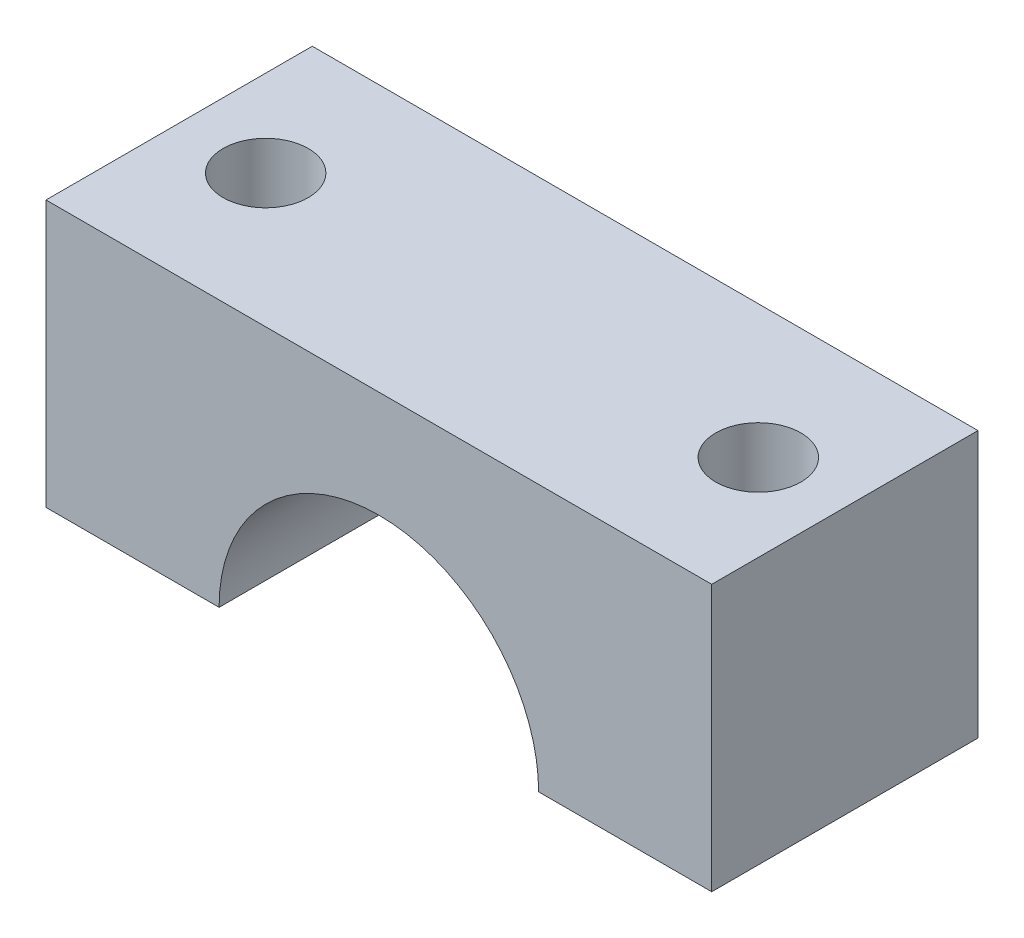
ISO-10303-21;
HEADER;
FILE_DESCRIPTION(('STEP AP214'),'2;1');
FILE_NAME('part.step','',(''),(''),'','','');
FILE_SCHEMA(('AUTOMOTIVE_DESIGN { 1 0 10303 214 1 1 1 1 }'));
ENDSEC;
DATA;
#1=APPLICATION_CONTEXT('core data for automotive mechanical design processes');
#2=APPLICATION_PROTOCOL_DEFINITION('international standard','automotive_design',2000,#1);
#3=PRODUCT_CONTEXT('',#1,'mechanical');
#4=PRODUCT('Part','Part','',(#3));
#5=PRODUCT_RELATED_PRODUCT_CATEGORY('part','',(#4));
#6=PRODUCT_DEFINITION_FORMATION('','',#4);
#7=PRODUCT_DEFINITION_CONTEXT('part definition',#1,'design');
#8=PRODUCT_DEFINITION('design','',#6,#7);
#9=PRODUCT_DEFINITION_SHAPE('','',#8);
#10=(LENGTH_UNIT() NAMED_UNIT(*) SI_UNIT(.MILLI.,.METRE.));
#11=(NAMED_UNIT(*) PLANE_ANGLE_UNIT() SI_UNIT($,.RADIAN.));
#12=(NAMED_UNIT(*) SI_UNIT($,.STERADIAN.) SOLID_ANGLE_UNIT());
#13=UNCERTAINTY_MEASURE_WITH_UNIT(LENGTH_MEASURE(1.E-05),#10,'distance_accuracy_value','');
#14=(GEOMETRIC_REPRESENTATION_CONTEXT(3) GLOBAL_UNCERTAINTY_ASSIGNED_CONTEXT((#13)) GLOBAL_UNIT_ASSIGNED_CONTEXT((#10,
#11,#12)) REPRESENTATION_CONTEXT('',''));
#15=CARTESIAN_POINT('',(0.,0.,0.));
#16=DIRECTION('',(0.,0.,1.));
#17=DIRECTION('',(1.,0.,0.));
#18=AXIS2_PLACEMENT_3D('',#15,#16,#17);
#19=CARTESIAN_POINT('',(0.,0.,0.));
#20=DIRECTION('',(0.,-1.,0.));
#21=DIRECTION('',(0.,0.,-1.));
#22=AXIS2_PLACEMENT_3D('',#19,#20,#21);
#23=PLANE('',#22);
#24=DIRECTION('',(0.,0.,1.));
#25=VECTOR('',#24,1.);
#26=CARTESIAN_POINT('',(5.99999999999999,0.,-20.));
#27=LINE('',#26,#25);
#28=CARTESIAN_POINT('',(5.99999999999999,0.,-5.));
#29=VERTEX_POINT('',#28);
#30=CARTESIAN_POINT('',(5.99999999999999,0.,5.));
#31=VERTEX_POINT('',#30);
#32=EDGE_CURVE('E11',#29,#31,#27,.T.);
#33=ORIENTED_EDGE('',*,*,#32,.F.);
#34=DIRECTION('',(-1.,0.,0.));
#35=VECTOR('',#34,1.);
#36=CARTESIAN_POINT('',(-12.5,0.,-5.));
#37=LINE('',#36,#35);
#38=CARTESIAN_POINT('',(12.5,0.,-5.));
#39=VERTEX_POINT('',#38);
#40=EDGE_CURVE('E127',#39,#29,#37,.T.);
#41=ORIENTED_EDGE('',*,*,#40,.F.);
#42=DIRECTION('',(0.,0.,-1.));
#43=VECTOR('',#42,1.);
#44=CARTESIAN_POINT('',(12.5,0.,5.));
#45=LINE('',#44,#43);
#46=CARTESIAN_POINT('',(12.5,0.,5.));
#47=VERTEX_POINT('',#46);
#48=EDGE_CURVE('E120',#47,#39,#45,.T.);
#49=ORIENTED_EDGE('',*,*,#48,.F.);
#50=DIRECTION('',(1.,0.,0.));
#51=VECTOR('',#50,1.);
#52=CARTESIAN_POINT('',(-12.5,0.,5.));
#53=LINE('',#52,#51);
#54=EDGE_CURVE('E89',#31,#47,#53,.T.);
#55=ORIENTED_EDGE('',*,*,#54,.F.);
#56=EDGE_LOOP('',(#33,#41,#49,#55));
#57=FACE_BOUND('',#56,.T.);
#58=CARTESIAN_POINT('',(9.24999999999999,0.,0.));
#59=DIRECTION('',(0.,1.,0.));
#60=DIRECTION('',(0.,0.,1.));
#61=AXIS2_PLACEMENT_3D('',#58,#59,#60);
#62=CIRCLE('',#61,1.6);
#63=CARTESIAN_POINT('',(9.24999999999999,0.,1.6));
#64=VERTEX_POINT('',#63);
#65=EDGE_CURVE('E149',#64,#64,#62,.T.);
#66=ORIENTED_EDGE('',*,*,#65,.T.);
#67=EDGE_LOOP('',(#66));
#68=FACE_BOUND('',#67,.T.);
#69=ADVANCED_FACE('F45',(#57,#68),#23,.T.);
#70=CARTESIAN_POINT('',(12.5,10.,5.));
#71=DIRECTION('',(-1.,0.,0.));
#72=DIRECTION('',(0.,0.,1.));
#73=AXIS2_PLACEMENT_3D('',#70,#71,#72);
#74=PLANE('',#73);
#75=ORIENTED_EDGE('',*,*,#48,.T.);
#76=DIRECTION('',(0.,-1.,0.));
#77=VECTOR('',#76,1.);
#78=CARTESIAN_POINT('',(12.5,10.,-5.));
#79=LINE('',#78,#77);
#80=CARTESIAN_POINT('',(12.5,10.,-5.));
#81=VERTEX_POINT('',#80);
#82=EDGE_CURVE('E141',#81,#39,#79,.T.);
#83=ORIENTED_EDGE('',*,*,#82,.F.);
#84=DIRECTION('',(0.,0.,-1.));
#85=VECTOR('',#84,1.);
#86=CARTESIAN_POINT('',(12.5,10.,5.));
#87=LINE('',#86,#85);
#88=CARTESIAN_POINT('',(12.5,10.,5.));
#89=VERTEX_POINT('',#88);
#90=EDGE_CURVE('E126',#89,#81,#87,.T.);
#91=ORIENTED_EDGE('',*,*,#90,.F.);
#92=DIRECTION('',(0.,-1.,0.));
#93=VECTOR('',#92,1.);
#94=CARTESIAN_POINT('',(12.5,10.,5.));
#95=LINE('',#94,#93);
#96=EDGE_CURVE('E131',#89,#47,#95,.T.);
#97=ORIENTED_EDGE('',*,*,#96,.T.);
#98=EDGE_LOOP('',(#75,#83,#91,#97));
#99=FACE_BOUND('',#98,.T.);
#100=ADVANCED_FACE('F47',(#99),#74,.F.);
#101=CARTESIAN_POINT('',(-12.5,10.,-5.));
#102=DIRECTION('',(0.,0.,1.));
#103=DIRECTION('',(1.,0.,0.));
#104=AXIS2_PLACEMENT_3D('',#101,#102,#103);
#105=PLANE('',#104);
#106=ORIENTED_EDGE('',*,*,#40,.T.);
#107=CARTESIAN_POINT('',(0.,0.,-5.));
#108=DIRECTION('',(0.,0.,1.));
#109=DIRECTION('',(1.,0.,0.));
#110=AXIS2_PLACEMENT_3D('',#107,#108,#109);
#111=CIRCLE('',#110,6.);
#112=CARTESIAN_POINT('',(-6.00000000000001,0.,-5.));
#113=VERTEX_POINT('',#112);
#114=EDGE_CURVE('E107',#29,#113,#111,.T.);
#115=ORIENTED_EDGE('',*,*,#114,.T.);
#116=CARTESIAN_POINT('',(-12.5,0.,-5.));
#117=VERTEX_POINT('',#116);
#118=EDGE_CURVE('E147',#113,#117,#37,.T.);
#119=ORIENTED_EDGE('',*,*,#118,.T.);
#120=DIRECTION('',(0.,-1.,0.));
#121=VECTOR('',#120,1.);
#122=CARTESIAN_POINT('',(-12.5,10.,-5.));
#123=LINE('',#122,#121);
#124=CARTESIAN_POINT('',(-12.5,10.,-5.));
#125=VERTEX_POINT('',#124);
#126=EDGE_CURVE('E137',#125,#117,#123,.T.);
#127=ORIENTED_EDGE('',*,*,#126,.F.);
#128=DIRECTION('',(-1.,0.,0.));
#129=VECTOR('',#128,1.);
#130=CARTESIAN_POINT('',(-12.5,10.,-5.));
#131=LINE('',#130,#129);
#132=EDGE_CURVE('E97',#81,#125,#131,.T.);
#133=ORIENTED_EDGE('',*,*,#132,.F.);
#134=ORIENTED_EDGE('',*,*,#82,.T.);
#135=EDGE_LOOP('',(#106,#115,#119,#127,#133,#134));
#136=FACE_BOUND('',#135,.T.);
#137=ADVANCED_FACE('F146',(#136),#105,.F.);
#138=CARTESIAN_POINT('',(-12.5,10.,5.));
#139=DIRECTION('',(1.,0.,0.));
#140=DIRECTION('',(0.,0.,-1.));
#141=AXIS2_PLACEMENT_3D('',#138,#139,#140);
#142=PLANE('',#141);
#143=DIRECTION('',(0.,0.,1.));
#144=VECTOR('',#143,1.);
#145=CARTESIAN_POINT('',(-12.5,0.,5.));
#146=LINE('',#145,#144);
#147=CARTESIAN_POINT('',(-12.5,0.,5.));
#148=VERTEX_POINT('',#147);
#149=EDGE_CURVE('E122',#117,#148,#146,.T.);
#150=ORIENTED_EDGE('',*,*,#149,.T.);
#151=DIRECTION('',(0.,-1.,0.));
#152=VECTOR('',#151,1.);
#153=CARTESIAN_POINT('',(-12.5,10.,5.));
#154=LINE('',#153,#152);
#155=CARTESIAN_POINT('',(-12.5,10.,5.));
#156=VERTEX_POINT('',#155);
#157=EDGE_CURVE('E134',#156,#148,#154,.T.);
#158=ORIENTED_EDGE('',*,*,#157,.F.);
#159=DIRECTION('',(0.,0.,1.));
#160=VECTOR('',#159,1.);
#161=CARTESIAN_POINT('',(-12.5,10.,5.));
#162=LINE('',#161,#160);
#163=EDGE_CURVE('E162',#125,#156,#162,.T.);
#164=ORIENTED_EDGE('',*,*,#163,.F.);
#165=ORIENTED_EDGE('',*,*,#126,.T.);
#166=EDGE_LOOP('',(#150,#158,#164,#165));
#167=FACE_BOUND('',#166,.T.);
#168=ADVANCED_FACE('F202',(#167),#142,.F.);
#169=CARTESIAN_POINT('',(-12.5,10.,5.));
#170=DIRECTION('',(0.,0.,-1.));
#171=DIRECTION('',(-1.,0.,0.));
#172=AXIS2_PLACEMENT_3D('',#169,#170,#171);
#173=PLANE('',#172);
#174=CARTESIAN_POINT('',(-6.00000000000001,0.,5.));
#175=VERTEX_POINT('',#174);
#176=EDGE_CURVE('E114',#148,#175,#53,.T.);
#177=ORIENTED_EDGE('',*,*,#176,.T.);
#178=CARTESIAN_POINT('',(0.,0.,5.));
#179=DIRECTION('',(0.,0.,1.));
#180=DIRECTION('',(1.,0.,0.));
#181=AXIS2_PLACEMENT_3D('',#178,#179,#180);
#182=CIRCLE('',#181,6.);
#183=EDGE_CURVE('E60',#31,#175,#182,.T.);
#184=ORIENTED_EDGE('',*,*,#183,.F.);
#185=ORIENTED_EDGE('',*,*,#54,.T.);
#186=ORIENTED_EDGE('',*,*,#96,.F.);
#187=DIRECTION('',(1.,0.,0.));
#188=VECTOR('',#187,1.);
#189=CARTESIAN_POINT('',(-12.5,10.,5.));
#190=LINE('',#189,#188);
#191=EDGE_CURVE('E69',#156,#89,#190,.T.);
#192=ORIENTED_EDGE('',*,*,#191,.F.);
#193=ORIENTED_EDGE('',*,*,#157,.T.);
#194=EDGE_LOOP('',(#177,#184,#185,#186,#192,#193));
#195=FACE_BOUND('',#194,.T.);
#196=ADVANCED_FACE('F111',(#195),#173,.F.);
#197=CARTESIAN_POINT('',(0.,10.,0.));
#198=DIRECTION('',(0.,-1.,0.));
#199=DIRECTION('',(0.,0.,-1.));
#200=AXIS2_PLACEMENT_3D('',#197,#198,#199);
#201=PLANE('',#200);
#202=CARTESIAN_POINT('',(-9.25000000000001,10.,0.));
#203=DIRECTION('',(0.,1.,0.));
#204=DIRECTION('',(0.,0.,1.));
#205=AXIS2_PLACEMENT_3D('',#202,#203,#204);
#206=CIRCLE('',#205,1.6);
#207=CARTESIAN_POINT('',(-9.25000000000001,10.,1.6));
#208=VERTEX_POINT('',#207);
#209=EDGE_CURVE('E176',#208,#208,#206,.T.);
#210=ORIENTED_EDGE('',*,*,#209,.F.);
#211=EDGE_LOOP('',(#210));
#212=FACE_BOUND('',#211,.T.);
#213=CARTESIAN_POINT('',(9.24999999999999,10.,0.));
#214=DIRECTION('',(0.,1.,0.));
#215=DIRECTION('',(0.,0.,1.));
#216=AXIS2_PLACEMENT_3D('',#213,#214,#215);
#217=CIRCLE('',#216,1.6);
#218=CARTESIAN_POINT('',(9.24999999999999,10.,1.6));
#219=VERTEX_POINT('',#218);
#220=EDGE_CURVE('E172',#219,#219,#217,.T.);
#221=ORIENTED_EDGE('',*,*,#220,.F.);
#222=EDGE_LOOP('',(#221));
#223=FACE_BOUND('',#222,.T.);
#224=ORIENTED_EDGE('',*,*,#90,.T.);
#225=ORIENTED_EDGE('',*,*,#132,.T.);
#226=ORIENTED_EDGE('',*,*,#163,.T.);
#227=ORIENTED_EDGE('',*,*,#191,.T.);
#228=EDGE_LOOP('',(#224,#225,#226,#227));
#229=FACE_BOUND('',#228,.T.);
#230=ADVANCED_FACE('F191',(#212,#223,#229),#201,.F.);
#231=DIRECTION('',(0.,0.,1.));
#232=VECTOR('',#231,1.);
#233=CARTESIAN_POINT('',(-6.00000000000001,0.,-20.));
#234=LINE('',#233,#232);
#235=EDGE_CURVE('E54',#175,#113,#234,.F.);
#236=ORIENTED_EDGE('',*,*,#235,.F.);
#237=ORIENTED_EDGE('',*,*,#176,.F.);
#238=ORIENTED_EDGE('',*,*,#149,.F.);
#239=ORIENTED_EDGE('',*,*,#118,.F.);
#240=EDGE_LOOP('',(#236,#237,#238,#239));
#241=FACE_BOUND('',#240,.T.);
#242=CARTESIAN_POINT('',(-9.25000000000001,0.,0.));
#243=DIRECTION('',(0.,1.,0.));
#244=DIRECTION('',(0.,0.,1.));
#245=AXIS2_PLACEMENT_3D('',#242,#243,#244);
#246=CIRCLE('',#245,1.6);
#247=CARTESIAN_POINT('',(-9.25000000000001,0.,1.6));
#248=VERTEX_POINT('',#247);
#249=EDGE_CURVE('E157',#248,#248,#246,.T.);
#250=ORIENTED_EDGE('',*,*,#249,.T.);
#251=EDGE_LOOP('',(#250));
#252=FACE_BOUND('',#251,.T.);
#253=ADVANCED_FACE('F152',(#241,#252),#23,.T.);
#254=CARTESIAN_POINT('',(9.24999999999999,0.,0.));
#255=DIRECTION('',(0.,1.,0.));
#256=DIRECTION('',(0.,0.,1.));
#257=AXIS2_PLACEMENT_3D('',#254,#255,#256);
#258=CYLINDRICAL_SURFACE('',#257,1.6);
#259=ORIENTED_EDGE('',*,*,#65,.F.);
#260=EDGE_LOOP('',(#259));
#261=FACE_BOUND('',#260,.T.);
#262=ORIENTED_EDGE('',*,*,#220,.T.);
#263=EDGE_LOOP('',(#262));
#264=FACE_BOUND('',#263,.T.);
#265=ADVANCED_FACE('F187',(#261,#264),#258,.F.);
#266=CARTESIAN_POINT('',(-9.25000000000001,0.,0.));
#267=DIRECTION('',(0.,1.,0.));
#268=DIRECTION('',(0.,0.,1.));
#269=AXIS2_PLACEMENT_3D('',#266,#267,#268);
#270=CYLINDRICAL_SURFACE('',#269,1.6);
#271=ORIENTED_EDGE('',*,*,#249,.F.);
#272=EDGE_LOOP('',(#271));
#273=FACE_BOUND('',#272,.T.);
#274=ORIENTED_EDGE('',*,*,#209,.T.);
#275=EDGE_LOOP('',(#274));
#276=FACE_BOUND('',#275,.T.);
#277=ADVANCED_FACE('F184',(#273,#276),#270,.F.);
#278=CARTESIAN_POINT('',(0.,0.,-20.));
#279=DIRECTION('',(0.,0.,1.));
#280=DIRECTION('',(1.,0.,0.));
#281=AXIS2_PLACEMENT_3D('',#278,#279,#280);
#282=CYLINDRICAL_SURFACE('',#281,6.);
#283=ORIENTED_EDGE('',*,*,#32,.T.);
#284=ORIENTED_EDGE('',*,*,#183,.T.);
#285=ORIENTED_EDGE('',*,*,#235,.T.);
#286=ORIENTED_EDGE('',*,*,#114,.F.);
#287=EDGE_LOOP('',(#283,#284,#285,#286));
#288=FACE_BOUND('',#287,.T.);
#289=ADVANCED_FACE('F105',(#288),#282,.F.);
#290=CLOSED_SHELL('',(#69,#100,#137,#168,#196,#230,#253,#265,#277,#289));
#291=MANIFOLD_SOLID_BREP('B2',#290);
#292=ADVANCED_BREP_SHAPE_REPRESENTATION('',(#18,#291),#14);
#293=SHAPE_DEFINITION_REPRESENTATION(#9,#292);
ENDSEC;
END-ISO-10303-21;
